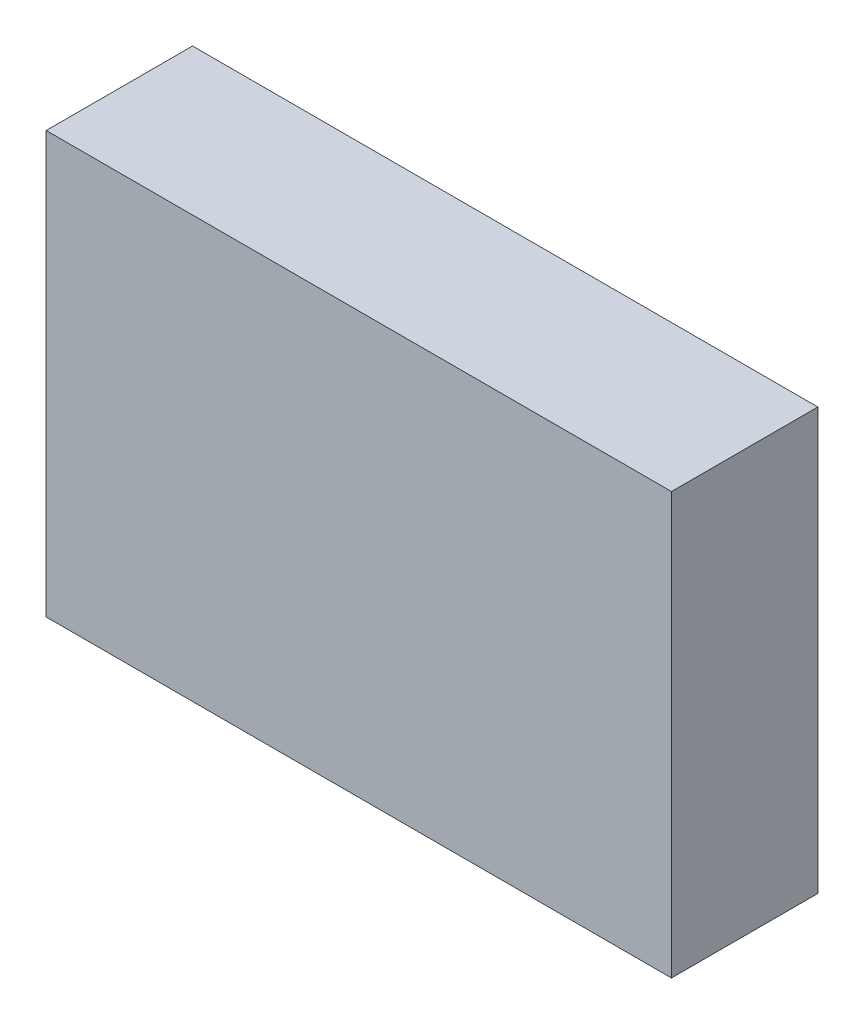
ISO-10303-21;
HEADER;
FILE_DESCRIPTION(('STEP AP214'),'2;1');
FILE_NAME('part.step','',(''),(''),'','','');
FILE_SCHEMA(('AUTOMOTIVE_DESIGN { 1 0 10303 214 1 1 1 1 }'));
ENDSEC;
DATA;
#1=APPLICATION_CONTEXT('core data for automotive mechanical design processes');
#2=APPLICATION_PROTOCOL_DEFINITION('international standard','automotive_design',2000,#1);
#3=PRODUCT_CONTEXT('',#1,'mechanical');
#4=PRODUCT('Part','Part','',(#3));
#5=PRODUCT_RELATED_PRODUCT_CATEGORY('part','',(#4));
#6=PRODUCT_DEFINITION_FORMATION('','',#4);
#7=PRODUCT_DEFINITION_CONTEXT('part definition',#1,'design');
#8=PRODUCT_DEFINITION('design','',#6,#7);
#9=PRODUCT_DEFINITION_SHAPE('','',#8);
#10=(LENGTH_UNIT() NAMED_UNIT(*) SI_UNIT(.MILLI.,.METRE.));
#11=(NAMED_UNIT(*) PLANE_ANGLE_UNIT() SI_UNIT($,.RADIAN.));
#12=(NAMED_UNIT(*) SI_UNIT($,.STERADIAN.) SOLID_ANGLE_UNIT());
#13=UNCERTAINTY_MEASURE_WITH_UNIT(LENGTH_MEASURE(1.E-05),#10,'distance_accuracy_value','');
#14=(GEOMETRIC_REPRESENTATION_CONTEXT(3) GLOBAL_UNCERTAINTY_ASSIGNED_CONTEXT((#13)) GLOBAL_UNIT_ASSIGNED_CONTEXT((#10,
#11,#12)) REPRESENTATION_CONTEXT('',''));
#15=CARTESIAN_POINT('',(0.,0.,0.));
#16=DIRECTION('',(0.,0.,1.));
#17=DIRECTION('',(1.,0.,0.));
#18=AXIS2_PLACEMENT_3D('',#15,#16,#17);
#19=CARTESIAN_POINT('',(-3.525,2.125,1.65));
#20=DIRECTION('',(1.,0.,0.));
#21=DIRECTION('',(0.,0.,-1.));
#22=AXIS2_PLACEMENT_3D('',#19,#20,#21);
#23=PLANE('',#22);
#24=DIRECTION('',(0.,-1.,0.));
#25=VECTOR('',#24,1.);
#26=CARTESIAN_POINT('',(-3.525,2.125,0.));
#27=LINE('',#26,#25);
#28=CARTESIAN_POINT('',(-3.525,2.125,0.));
#29=VERTEX_POINT('',#28);
#30=CARTESIAN_POINT('',(-3.525,-2.625,0.));
#31=VERTEX_POINT('',#30);
#32=EDGE_CURVE('E97',#29,#31,#27,.T.);
#33=ORIENTED_EDGE('',*,*,#32,.T.);
#34=DIRECTION('',(0.,0.,-1.));
#35=VECTOR('',#34,1.);
#36=CARTESIAN_POINT('',(-3.525,-2.625,1.65));
#37=LINE('',#36,#35);
#38=CARTESIAN_POINT('',(-3.525,-2.625,1.65));
#39=VERTEX_POINT('',#38);
#40=EDGE_CURVE('E11',#39,#31,#37,.T.);
#41=ORIENTED_EDGE('',*,*,#40,.F.);
#42=DIRECTION('',(0.,-1.,0.));
#43=VECTOR('',#42,1.);
#44=CARTESIAN_POINT('',(-3.525,2.125,1.65));
#45=LINE('',#44,#43);
#46=CARTESIAN_POINT('',(-3.525,2.125,1.65));
#47=VERTEX_POINT('',#46);
#48=EDGE_CURVE('E85',#47,#39,#45,.T.);
#49=ORIENTED_EDGE('',*,*,#48,.F.);
#50=DIRECTION('',(0.,0.,-1.));
#51=VECTOR('',#50,1.);
#52=CARTESIAN_POINT('',(-3.525,2.125,1.65));
#53=LINE('',#52,#51);
#54=EDGE_CURVE('E93',#47,#29,#53,.T.);
#55=ORIENTED_EDGE('',*,*,#54,.T.);
#56=EDGE_LOOP('',(#33,#41,#49,#55));
#57=FACE_BOUND('',#56,.T.);
#58=ADVANCED_FACE('F34',(#57),#23,.F.);
#59=CARTESIAN_POINT('',(-3.525,-2.625,1.65));
#60=DIRECTION('',(0.,1.,0.));
#61=DIRECTION('',(0.,0.,1.));
#62=AXIS2_PLACEMENT_3D('',#59,#60,#61);
#63=PLANE('',#62);
#64=DIRECTION('',(1.,0.,0.));
#65=VECTOR('',#64,1.);
#66=CARTESIAN_POINT('',(-3.525,-2.625,0.));
#67=LINE('',#66,#65);
#68=CARTESIAN_POINT('',(3.525,-2.625,0.));
#69=VERTEX_POINT('',#68);
#70=EDGE_CURVE('E89',#31,#69,#67,.T.);
#71=ORIENTED_EDGE('',*,*,#70,.T.);
#72=DIRECTION('',(0.,0.,-1.));
#73=VECTOR('',#72,1.);
#74=CARTESIAN_POINT('',(3.525,-2.625,1.65));
#75=LINE('',#74,#73);
#76=CARTESIAN_POINT('',(3.525,-2.625,1.65));
#77=VERTEX_POINT('',#76);
#78=EDGE_CURVE('E42',#77,#69,#75,.T.);
#79=ORIENTED_EDGE('',*,*,#78,.F.);
#80=DIRECTION('',(1.,0.,0.));
#81=VECTOR('',#80,1.);
#82=CARTESIAN_POINT('',(-3.525,-2.625,1.65));
#83=LINE('',#82,#81);
#84=EDGE_CURVE('E80',#39,#77,#83,.T.);
#85=ORIENTED_EDGE('',*,*,#84,.F.);
#86=ORIENTED_EDGE('',*,*,#40,.T.);
#87=EDGE_LOOP('',(#71,#79,#85,#86));
#88=FACE_BOUND('',#87,.T.);
#89=ADVANCED_FACE('F88',(#88),#63,.F.);
#90=CARTESIAN_POINT('',(3.525,-2.625,1.65));
#91=DIRECTION('',(-1.,0.,0.));
#92=DIRECTION('',(0.,0.,1.));
#93=AXIS2_PLACEMENT_3D('',#90,#91,#92);
#94=PLANE('',#93);
#95=DIRECTION('',(0.,1.,0.));
#96=VECTOR('',#95,1.);
#97=CARTESIAN_POINT('',(3.525,-2.625,0.));
#98=LINE('',#97,#96);
#99=CARTESIAN_POINT('',(3.525,2.125,0.));
#100=VERTEX_POINT('',#99);
#101=EDGE_CURVE('E67',#69,#100,#98,.T.);
#102=ORIENTED_EDGE('',*,*,#101,.T.);
#103=DIRECTION('',(0.,0.,-1.));
#104=VECTOR('',#103,1.);
#105=CARTESIAN_POINT('',(3.525,2.125,1.65));
#106=LINE('',#105,#104);
#107=CARTESIAN_POINT('',(3.525,2.125,1.65));
#108=VERTEX_POINT('',#107);
#109=EDGE_CURVE('E90',#108,#100,#106,.T.);
#110=ORIENTED_EDGE('',*,*,#109,.F.);
#111=DIRECTION('',(0.,1.,0.));
#112=VECTOR('',#111,1.);
#113=CARTESIAN_POINT('',(3.525,-2.625,1.65));
#114=LINE('',#113,#112);
#115=EDGE_CURVE('E83',#77,#108,#114,.T.);
#116=ORIENTED_EDGE('',*,*,#115,.F.);
#117=ORIENTED_EDGE('',*,*,#78,.T.);
#118=EDGE_LOOP('',(#102,#110,#116,#117));
#119=FACE_BOUND('',#118,.T.);
#120=ADVANCED_FACE('F91',(#119),#94,.F.);
#121=CARTESIAN_POINT('',(3.525,2.125,1.65));
#122=DIRECTION('',(0.,-1.,0.));
#123=DIRECTION('',(0.,0.,-1.));
#124=AXIS2_PLACEMENT_3D('',#121,#122,#123);
#125=PLANE('',#124);
#126=DIRECTION('',(-1.,0.,0.));
#127=VECTOR('',#126,1.);
#128=CARTESIAN_POINT('',(3.525,2.125,0.));
#129=LINE('',#128,#127);
#130=EDGE_CURVE('E73',#100,#29,#129,.T.);
#131=ORIENTED_EDGE('',*,*,#130,.T.);
#132=ORIENTED_EDGE('',*,*,#54,.F.);
#133=DIRECTION('',(-1.,0.,0.));
#134=VECTOR('',#133,1.);
#135=CARTESIAN_POINT('',(3.525,2.125,1.65));
#136=LINE('',#135,#134);
#137=EDGE_CURVE('E50',#108,#47,#136,.T.);
#138=ORIENTED_EDGE('',*,*,#137,.F.);
#139=ORIENTED_EDGE('',*,*,#109,.T.);
#140=EDGE_LOOP('',(#131,#132,#138,#139));
#141=FACE_BOUND('',#140,.T.);
#142=ADVANCED_FACE('F104',(#141),#125,.F.);
#143=CARTESIAN_POINT('',(0.,0.,1.65));
#144=DIRECTION('',(0.,0.,1.));
#145=DIRECTION('',(1.,0.,0.));
#146=AXIS2_PLACEMENT_3D('',#143,#144,#145);
#147=PLANE('',#146);
#148=ORIENTED_EDGE('',*,*,#48,.T.);
#149=ORIENTED_EDGE('',*,*,#84,.T.);
#150=ORIENTED_EDGE('',*,*,#115,.T.);
#151=ORIENTED_EDGE('',*,*,#137,.T.);
#152=EDGE_LOOP('',(#148,#149,#150,#151));
#153=FACE_BOUND('',#152,.T.);
#154=ADVANCED_FACE('F81',(#153),#147,.T.);
#155=CARTESIAN_POINT('',(0.,0.,0.));
#156=DIRECTION('',(0.,0.,1.));
#157=DIRECTION('',(1.,0.,0.));
#158=AXIS2_PLACEMENT_3D('',#155,#156,#157);
#159=PLANE('',#158);
#160=ORIENTED_EDGE('',*,*,#32,.F.);
#161=ORIENTED_EDGE('',*,*,#130,.F.);
#162=ORIENTED_EDGE('',*,*,#101,.F.);
#163=ORIENTED_EDGE('',*,*,#70,.F.);
#164=EDGE_LOOP('',(#160,#161,#162,#163));
#165=FACE_BOUND('',#164,.T.);
#166=ADVANCED_FACE('F107',(#165),#159,.F.);
#167=CLOSED_SHELL('',(#58,#89,#120,#142,#154,#166));
#168=MANIFOLD_SOLID_BREP('B2',#167);
#169=ADVANCED_BREP_SHAPE_REPRESENTATION('',(#18,#168),#14);
#170=SHAPE_DEFINITION_REPRESENTATION(#9,#169);
ENDSEC;
END-ISO-10303-21;
